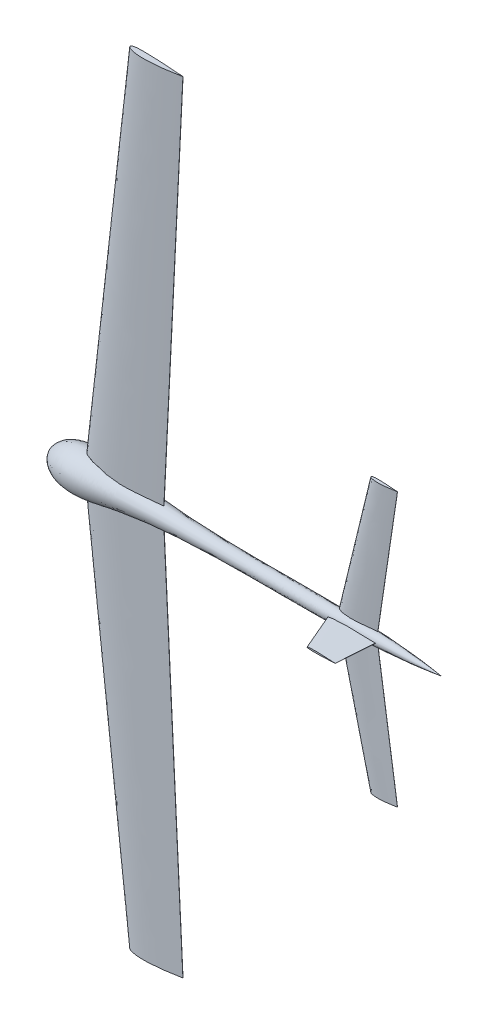
ISO-10303-21;
HEADER;
FILE_DESCRIPTION(('STEP AP214'),'2;1');
FILE_NAME('part.step','',(''),(''),'','','');
FILE_SCHEMA(('AUTOMOTIVE_DESIGN { 1 0 10303 214 1 1 1 1 }'));
ENDSEC;
DATA;
#1=APPLICATION_CONTEXT('core data for automotive mechanical design processes');
#2=APPLICATION_PROTOCOL_DEFINITION('international standard','automotive_design',2000,#1);
#3=PRODUCT_CONTEXT('',#1,'mechanical');
#4=PRODUCT('Part','Part','',(#3));
#5=PRODUCT_RELATED_PRODUCT_CATEGORY('part','',(#4));
#6=PRODUCT_DEFINITION_FORMATION('','',#4);
#7=PRODUCT_DEFINITION_CONTEXT('part definition',#1,'design');
#8=PRODUCT_DEFINITION('design','',#6,#7);
#9=PRODUCT_DEFINITION_SHAPE('','',#8);
#10=(LENGTH_UNIT() NAMED_UNIT(*) SI_UNIT(.MILLI.,.METRE.));
#11=(NAMED_UNIT(*) PLANE_ANGLE_UNIT() SI_UNIT($,.RADIAN.));
#12=(NAMED_UNIT(*) SI_UNIT($,.STERADIAN.) SOLID_ANGLE_UNIT());
#13=UNCERTAINTY_MEASURE_WITH_UNIT(LENGTH_MEASURE(1.E-05),#10,'distance_accuracy_value','');
#14=(GEOMETRIC_REPRESENTATION_CONTEXT(3) GLOBAL_UNCERTAINTY_ASSIGNED_CONTEXT((#13)) GLOBAL_UNIT_ASSIGNED_CONTEXT((#10,
#11,#12)) REPRESENTATION_CONTEXT('',''));
#15=CARTESIAN_POINT('',(0.,0.,0.));
#16=DIRECTION('',(0.,0.,1.));
#17=DIRECTION('',(1.,0.,0.));
#18=AXIS2_PLACEMENT_3D('',#15,#16,#17);
#19=CARTESIAN_POINT('',(-239.539873872403,-126.614051160963,871.963213135709));
#20=CARTESIAN_POINT('',(-189.539704872603,-1126.61405116096,872.054661040045));
#21=CARTESIAN_POINT('',(-252.815582554837,-126.614051160963,874.683587318627));
#22=CARTESIAN_POINT('',(-198.512245297456,-1126.61405116096,873.893257224312));
#23=CARTESIAN_POINT('',(-279.392779573486,-126.614051160963,879.477046379055));
#24=CARTESIAN_POINT('',(-216.474749622715,-1126.61405116096,877.13297166995));
#25=CARTESIAN_POINT('',(-312.798569751114,-126.614051160964,883.940220329952));
#26=CARTESIAN_POINT('',(-239.052437184474,-1126.61405116096,880.149459125009));
#27=CARTESIAN_POINT('',(-352.816565755391,-126.614051160964,887.437977106368));
#28=CARTESIAN_POINT('',(-266.099060115051,-1126.61405116096,882.513458277402));
#29=CARTESIAN_POINT('',(-388.154158791389,-126.614051160965,888.580982744142));
#30=CARTESIAN_POINT('',(-289.982378860363,-1126.61405116096,883.285971785803));
#31=CARTESIAN_POINT('',(-418.1706467062,-126.614051160965,883.718829971556));
#32=CARTESIAN_POINT('',(-310.269367500308,-1126.61405116096,879.999829904611));
#33=CARTESIAN_POINT('',(-429.627528598417,-126.614051160965,880.031523833943));
#34=CARTESIAN_POINT('',(-318.012632916842,-1126.61405116096,877.507721636047));
#35=CARTESIAN_POINT('',(-433.900062991578,-126.614051160965,878.140488463595));
#36=CARTESIAN_POINT('',(-320.900274433858,-1126.61405116096,876.229643628225));
#37=CARTESIAN_POINT('',(-437.585512532485,-126.614051160965,875.847817258417));
#38=CARTESIAN_POINT('',(-323.391127900182,-1126.61405116096,874.680115421375));
#39=CARTESIAN_POINT('',(-440.799349600757,-126.614051160965,871.882967439265));
#40=CARTESIAN_POINT('',(-325.563236651869,-1126.61405116096,872.000426063029));
#41=CARTESIAN_POINT('',(-437.461029176359,-126.614051160965,868.397936016131));
#42=CARTESIAN_POINT('',(-323.306994392,-1126.61405116096,869.645027487033));
#43=CARTESIAN_POINT('',(-433.844515168122,-126.614051160965,866.808443981054));
#44=CARTESIAN_POINT('',(-320.862731798404,-1126.61405116096,868.570751011037));
#45=CARTESIAN_POINT('',(-427.954506164582,-126.614051160965,865.136614206667));
#46=CARTESIAN_POINT('',(-316.881901459987,-1126.61405116096,867.440825626789));
#47=CARTESIAN_POINT('',(-409.647972663736,-126.614051160965,862.876897070003));
#48=CARTESIAN_POINT('',(-304.50922021152,-1126.61405116096,865.913569806219));
#49=CARTESIAN_POINT('',(-379.53459287153,-126.614051160964,863.285434449735));
#50=CARTESIAN_POINT('',(-284.156746081681,-1126.61405116096,866.189684493758));
#51=CARTESIAN_POINT('',(-346.191328323639,-126.614051160964,864.578538423401));
#52=CARTESIAN_POINT('',(-261.621317186019,-1126.61405116096,867.063643689067));
#53=CARTESIAN_POINT('',(-299.52844032516,-126.614051160963,867.374378483249));
#54=CARTESIAN_POINT('',(-230.083667564292,-1126.61405116096,868.953244354348));
#55=CARTESIAN_POINT('',(-266.197932885908,-126.614051160963,869.561951602312));
#56=CARTESIAN_POINT('',(-207.55686070725,-1126.61405116096,870.431740810743));
#57=CARTESIAN_POINT('',(-239.539873872403,-126.614051160963,871.443213575108));
#58=CARTESIAN_POINT('',(-189.539704872603,-1126.61405116096,871.703213355405));
#59=B_SPLINE_SURFACE_WITH_KNOTS('',3,1,((#19,#20),(#21,#22),(#23,#24),(#25,#26),(#27,#28),(#29,
#30),(#31,#32),(#33,#34),(#35,#36),(#37,#38),(#39,#40),(#41,#42),(#43,#44),(#45,#46),(#47,#48),
(#49,#50),(#51,#52),(#53,#54),(#55,#56),(#57,#58)),.UNSPECIFIED.,.F.,.F.,.F.,(4,1,1,1,1,1,1,1,1,
1,1,1,1,1,1,1,1,4),(2,2),(0.,0.0996729249269685,0.198581096615965,0.247805170456832,
0.395091203654929,0.457489818915221,0.470406405435489,0.483879408669829,0.491264120322896,
0.503458853294664,0.513609129403887,0.520450990700287,0.533235387615153,0.558031884237173,
0.656174271859652,0.754320378530032,0.803437363555032,1.),(0.,1.),.UNSPECIFIED.);
#60=CARTESIAN_POINT('',(-239.539873872403,-126.614051160963,871.963213135709));
#61=CARTESIAN_POINT('',(-252.815582554837,-126.614051160963,874.683587318627));
#62=CARTESIAN_POINT('',(-279.392779573486,-126.614051160963,879.477046379055));
#63=CARTESIAN_POINT('',(-312.798569751114,-126.614051160964,883.940220329952));
#64=CARTESIAN_POINT('',(-352.816565755391,-126.614051160964,887.437977106368));
#65=CARTESIAN_POINT('',(-388.154158791389,-126.614051160965,888.580982744142));
#66=CARTESIAN_POINT('',(-418.1706467062,-126.614051160965,883.718829971556));
#67=CARTESIAN_POINT('',(-429.627528598417,-126.614051160965,880.031523833943));
#68=CARTESIAN_POINT('',(-433.900062991578,-126.614051160965,878.140488463595));
#69=CARTESIAN_POINT('',(-437.585512532485,-126.614051160965,875.847817258417));
#70=CARTESIAN_POINT('',(-440.799349600757,-126.614051160965,871.882967439265));
#71=CARTESIAN_POINT('',(-437.461029176359,-126.614051160965,868.397936016131));
#72=CARTESIAN_POINT('',(-433.844515168122,-126.614051160965,866.808443981054));
#73=CARTESIAN_POINT('',(-427.954506164582,-126.614051160965,865.136614206667));
#74=CARTESIAN_POINT('',(-409.647972663736,-126.614051160965,862.876897070003));
#75=CARTESIAN_POINT('',(-379.53459287153,-126.614051160964,863.285434449735));
#76=CARTESIAN_POINT('',(-346.191328323639,-126.614051160964,864.578538423401));
#77=CARTESIAN_POINT('',(-299.52844032516,-126.614051160963,867.374378483249));
#78=CARTESIAN_POINT('',(-266.197932885908,-126.614051160963,869.561951602312));
#79=CARTESIAN_POINT('',(-239.539873872403,-126.614051160963,871.443213575108));
#80=B_SPLINE_CURVE_WITH_KNOTS('',3,(#60,#61,#62,#63,#64,#65,#66,#67,#68,#69,#70,#71,#72,#73,#74,
#75,#76,#77,#78,#79),.UNSPECIFIED.,.F.,.F.,(4,1,1,1,1,1,1,1,1,1,1,1,1,1,1,1,1,4),(0.,
0.0996729249269685,0.198581096615965,0.247805170456832,0.395091203654929,0.457489818915221,
0.470406405435489,0.483879408669829,0.491264120322896,0.503458853294664,0.513609129403887,
0.520450990700287,0.533235387615153,0.558031884237173,0.656174271859652,0.754320378530032,
0.803437363555032,1.),.UNSPECIFIED.);
#81=CARTESIAN_POINT('',(-239.539873872403,-126.614051160963,871.963213135709));
#82=VERTEX_POINT('',#81);
#83=CARTESIAN_POINT('',(-239.539873872403,-126.614051160963,871.443213575108));
#84=VERTEX_POINT('',#83);
#85=EDGE_CURVE('P0_E10',#82,#84,#80,.T.);
#86=DIRECTION('',(0.0499377836282304,-0.998752296785844,0.000259675377735938));
#87=VECTOR('',#86,1.);
#88=CARTESIAN_POINT('',(-214.539789372503,-626.614051160962,871.573213465257));
#89=LINE('',#88,#87);
#90=CARTESIAN_POINT('',(-189.539704872603,-1126.61405116096,871.703213355405));
#91=VERTEX_POINT('',#90);
#92=EDGE_CURVE('P0_E26',#84,#91,#89,.T.);
#93=CARTESIAN_POINT('',(-189.539704872603,-1126.61405116096,872.054661040045));
#94=CARTESIAN_POINT('',(-198.512245297456,-1126.61405116096,873.893257224312));
#95=CARTESIAN_POINT('',(-216.474749622715,-1126.61405116096,877.13297166995));
#96=CARTESIAN_POINT('',(-239.052437184474,-1126.61405116096,880.149459125009));
#97=CARTESIAN_POINT('',(-266.099060115051,-1126.61405116096,882.513458277402));
#98=CARTESIAN_POINT('',(-289.982378860363,-1126.61405116096,883.285971785803));
#99=CARTESIAN_POINT('',(-310.269367500308,-1126.61405116096,879.999829904611));
#100=CARTESIAN_POINT('',(-318.012632916842,-1126.61405116096,877.507721636047));
#101=CARTESIAN_POINT('',(-320.900274433858,-1126.61405116096,876.229643628225));
#102=CARTESIAN_POINT('',(-323.391127900182,-1126.61405116096,874.680115421375));
#103=CARTESIAN_POINT('',(-325.563236651869,-1126.61405116096,872.000426063029));
#104=CARTESIAN_POINT('',(-323.306994392,-1126.61405116096,869.645027487033));
#105=CARTESIAN_POINT('',(-320.862731798404,-1126.61405116096,868.570751011037));
#106=CARTESIAN_POINT('',(-316.881901459987,-1126.61405116096,867.440825626789));
#107=CARTESIAN_POINT('',(-304.50922021152,-1126.61405116096,865.913569806219));
#108=CARTESIAN_POINT('',(-284.156746081681,-1126.61405116096,866.189684493758));
#109=CARTESIAN_POINT('',(-261.621317186019,-1126.61405116096,867.063643689067));
#110=CARTESIAN_POINT('',(-230.083667564292,-1126.61405116096,868.953244354348));
#111=CARTESIAN_POINT('',(-207.55686070725,-1126.61405116096,870.431740810743));
#112=CARTESIAN_POINT('',(-189.539704872603,-1126.61405116096,871.703213355405));
#113=B_SPLINE_CURVE_WITH_KNOTS('',3,(#93,#94,#95,#96,#97,#98,#99,#100,#101,#102,#103,#104,#105,
#106,#107,#108,#109,#110,#111,#112),.UNSPECIFIED.,.F.,.F.,(4,1,1,1,1,1,1,1,1,1,1,1,1,1,1,1,1,4),
(0.,0.0996729249269685,0.198581096615965,0.247805170456832,0.395091203654929,0.457489818915221,
0.470406405435489,0.483879408669829,0.491264120322896,0.503458853294664,0.513609129403887,
0.520450990700287,0.533235387615153,0.558031884237173,0.656174271859652,0.754320378530032,
0.803437363555032,1.),.UNSPECIFIED.);
#114=CARTESIAN_POINT('',(-189.539704872603,-1126.61405116096,872.054661040045));
#115=VERTEX_POINT('',#114);
#116=EDGE_CURVE('P0_E71',#115,#91,#113,.T.);
#117=DIRECTION('',(0.0499377851036283,-0.998752326293701,9.13338071910447E-05));
#118=VECTOR('',#117,1.);
#119=CARTESIAN_POINT('',(-214.539789372503,-626.614051160962,872.008937087877));
#120=LINE('',#119,#118);
#121=EDGE_CURVE('P0_E69',#82,#115,#120,.T.);
#122=ORIENTED_EDGE('',*,*,#85,.T.);
#123=ORIENTED_EDGE('',*,*,#92,.T.);
#124=ORIENTED_EDGE('',*,*,#116,.F.);
#125=ORIENTED_EDGE('',*,*,#121,.F.);
#126=EDGE_LOOP('',(#122,#123,#124,#125));
#127=FACE_BOUND('',#126,.T.);
#128=ADVANCED_FACE('P0_F16',(#127),#59,.T.);
#129=CARTESIAN_POINT('',(-239.539873872403,-126.614051160963,871.443213575108));
#130=DIRECTION('',(0.998752330459429,0.0499377853119154,0.));
#131=DIRECTION('',(0.,0.,1.));
#132=AXIS2_PLACEMENT_3D('',#129,#130,#131);
#133=PLANE('',#132);
#134=DIRECTION('',(0.,0.,1.));
#135=VECTOR('',#134,1.);
#136=CARTESIAN_POINT('',(-239.539873872403,-126.614051160963,871.703213355408));
#137=LINE('',#136,#135);
#138=EDGE_CURVE('P0_E59',#84,#82,#137,.T.);
#139=ORIENTED_EDGE('',*,*,#138,.T.);
#140=ORIENTED_EDGE('',*,*,#121,.T.);
#141=DIRECTION('',(0.,0.,1.));
#142=VECTOR('',#141,1.);
#143=CARTESIAN_POINT('',(-189.539704872603,-1126.61405116096,871.878937197725));
#144=LINE('',#143,#142);
#145=EDGE_CURVE('P0_E20',#91,#115,#144,.T.);
#146=ORIENTED_EDGE('',*,*,#145,.F.);
#147=ORIENTED_EDGE('',*,*,#92,.F.);
#148=EDGE_LOOP('',(#139,#140,#146,#147));
#149=FACE_BOUND('',#148,.T.);
#150=ADVANCED_FACE('P0_F18',(#149),#133,.T.);
#151=CARTESIAN_POINT('',(-324.586192315454,-1126.61405116096,872.767026516571));
#152=DIRECTION('',(0.,1.,0.));
#153=DIRECTION('',(-1.,0.,0.));
#154=AXIS2_PLACEMENT_3D('',#151,#152,#153);
#155=PLANE('',#154);
#156=ORIENTED_EDGE('',*,*,#116,.T.);
#157=ORIENTED_EDGE('',*,*,#145,.T.);
#158=EDGE_LOOP('',(#156,#157));
#159=FACE_BOUND('',#158,.T.);
#160=ADVANCED_FACE('P0_F106',(#159),#155,.F.);
#161=CARTESIAN_POINT('',(-239.539873872403,-126.614051160963,871.963213135709));
#162=CARTESIAN_POINT('',(-189.539704872631,873.385948839038,872.054661040052));
#163=CARTESIAN_POINT('',(-252.815582554837,-126.614051160963,874.683587318627));
#164=CARTESIAN_POINT('',(-198.512245297484,873.385948839038,873.893257224319));
#165=CARTESIAN_POINT('',(-279.392779573486,-126.614051160963,879.477046379055));
#166=CARTESIAN_POINT('',(-216.474749622743,873.385948839037,877.132971669957));
#167=CARTESIAN_POINT('',(-312.798569751114,-126.614051160964,883.940220329952));
#168=CARTESIAN_POINT('',(-239.052437184502,873.385948839037,880.149459125016));
#169=CARTESIAN_POINT('',(-352.816565755391,-126.614051160964,887.437977106368));
#170=CARTESIAN_POINT('',(-266.099060115078,873.385948839037,882.513458277409));
#171=CARTESIAN_POINT('',(-388.154158791389,-126.614051160965,888.580982744142));
#172=CARTESIAN_POINT('',(-289.982378860391,873.385948839036,883.28597178581));
#173=CARTESIAN_POINT('',(-418.1706467062,-126.614051160965,883.718829971556));
#174=CARTESIAN_POINT('',(-310.269367500336,873.385948839037,879.999829904618));
#175=CARTESIAN_POINT('',(-429.627528598417,-126.614051160965,880.031523833943));
#176=CARTESIAN_POINT('',(-318.01263291687,873.385948839036,877.507721636054));
#177=CARTESIAN_POINT('',(-433.900062991578,-126.614051160965,878.140488463595));
#178=CARTESIAN_POINT('',(-320.900274433886,873.385948839036,876.229643628232));
#179=CARTESIAN_POINT('',(-437.585512532485,-126.614051160965,875.847817258417));
#180=CARTESIAN_POINT('',(-323.39112790021,873.385948839036,874.680115421382));
#181=CARTESIAN_POINT('',(-440.799349600757,-126.614051160965,871.882967439265));
#182=CARTESIAN_POINT('',(-325.563236651897,873.385948839036,872.000426063036));
#183=CARTESIAN_POINT('',(-437.461029176359,-126.614051160965,868.397936016131));
#184=CARTESIAN_POINT('',(-323.306994392028,873.385948839036,869.64502748704));
#185=CARTESIAN_POINT('',(-433.844515168122,-126.614051160965,866.808443981054));
#186=CARTESIAN_POINT('',(-320.862731798432,873.385948839036,868.570751011044));
#187=CARTESIAN_POINT('',(-427.954506164582,-126.614051160965,865.136614206667));
#188=CARTESIAN_POINT('',(-316.881901460015,873.385948839036,867.440825626796));
#189=CARTESIAN_POINT('',(-409.647972663736,-126.614051160965,862.876897070003));
#190=CARTESIAN_POINT('',(-304.509220211548,873.385948839036,865.913569806226));
#191=CARTESIAN_POINT('',(-379.53459287153,-126.614051160964,863.285434449735));
#192=CARTESIAN_POINT('',(-284.156746081709,873.385948839037,866.189684493765));
#193=CARTESIAN_POINT('',(-346.191328323639,-126.614051160964,864.578538423401));
#194=CARTESIAN_POINT('',(-261.621317186047,873.385948839037,867.063643689074));
#195=CARTESIAN_POINT('',(-299.52844032516,-126.614051160963,867.374378483249));
#196=CARTESIAN_POINT('',(-230.08366756432,873.385948839038,868.953244354355));
#197=CARTESIAN_POINT('',(-266.197932885908,-126.614051160963,869.561951602312));
#198=CARTESIAN_POINT('',(-207.556860707278,873.385948839038,870.43174081075));
#199=CARTESIAN_POINT('',(-239.539873872403,-126.614051160963,871.443213575108));
#200=CARTESIAN_POINT('',(-189.539704872631,873.385948839038,871.703213355412));
#201=B_SPLINE_SURFACE_WITH_KNOTS('',3,1,((#161,#162),(#163,#164),(#165,#166),(#167,#168),(#169,
#170),(#171,#172),(#173,#174),(#175,#176),(#177,#178),(#179,#180),(#181,#182),(#183,#184),(#185,
#186),(#187,#188),(#189,#190),(#191,#192),(#193,#194),(#195,#196),(#197,#198),(#199,#200)),
.UNSPECIFIED.,.F.,.F.,.F.,(4,1,1,1,1,1,1,1,1,1,1,1,1,1,1,1,1,4),(2,2),(0.,0.0996729249269685,
0.198581096615965,0.247805170456832,0.395091203654929,0.457489818915221,0.470406405435489,
0.483879408669829,0.491264120322896,0.503458853294664,0.513609129403887,0.520450990700287,
0.533235387615153,0.558031884237173,0.656174271859652,0.754320378530032,0.803437363555032,1.),
(0.,1.),.UNSPECIFIED.);
#202=DIRECTION('',(0.0499377851036004,0.998752326293702,9.13338071980189E-05));
#203=VECTOR('',#202,1.);
#204=CARTESIAN_POINT('',(-214.539789372517,373.385948839038,872.00893708788));
#205=LINE('',#204,#203);
#206=CARTESIAN_POINT('',(-189.539704872631,873.385948839038,872.054661040052));
#207=VERTEX_POINT('',#206);
#208=EDGE_CURVE('P0_E56',#82,#207,#205,.T.);
#209=CARTESIAN_POINT('',(-189.539704872631,873.385948839038,872.054661040052));
#210=CARTESIAN_POINT('',(-198.512245297484,873.385948839038,873.893257224319));
#211=CARTESIAN_POINT('',(-216.474749622743,873.385948839037,877.132971669957));
#212=CARTESIAN_POINT('',(-239.052437184502,873.385948839037,880.149459125016));
#213=CARTESIAN_POINT('',(-266.099060115078,873.385948839037,882.513458277409));
#214=CARTESIAN_POINT('',(-289.982378860391,873.385948839036,883.28597178581));
#215=CARTESIAN_POINT('',(-310.269367500336,873.385948839037,879.999829904618));
#216=CARTESIAN_POINT('',(-318.01263291687,873.385948839036,877.507721636054));
#217=CARTESIAN_POINT('',(-320.900274433886,873.385948839036,876.229643628232));
#218=CARTESIAN_POINT('',(-323.39112790021,873.385948839036,874.680115421382));
#219=CARTESIAN_POINT('',(-325.563236651897,873.385948839036,872.000426063036));
#220=CARTESIAN_POINT('',(-323.306994392028,873.385948839036,869.64502748704));
#221=CARTESIAN_POINT('',(-320.862731798432,873.385948839036,868.570751011044));
#222=CARTESIAN_POINT('',(-316.881901460015,873.385948839036,867.440825626796));
#223=CARTESIAN_POINT('',(-304.509220211548,873.385948839036,865.913569806226));
#224=CARTESIAN_POINT('',(-284.156746081709,873.385948839037,866.189684493765));
#225=CARTESIAN_POINT('',(-261.621317186047,873.385948839037,867.063643689074));
#226=CARTESIAN_POINT('',(-230.08366756432,873.385948839038,868.953244354355));
#227=CARTESIAN_POINT('',(-207.556860707278,873.385948839038,870.43174081075));
#228=CARTESIAN_POINT('',(-189.539704872631,873.385948839038,871.703213355412));
#229=B_SPLINE_CURVE_WITH_KNOTS('',3,(#209,#210,#211,#212,#213,#214,#215,#216,#217,#218,#219,
#220,#221,#222,#223,#224,#225,#226,#227,#228),.UNSPECIFIED.,.F.,.F.,(4,1,1,1,1,1,1,1,1,1,1,1,1,
1,1,1,1,4),(0.,0.0996729249269685,0.198581096615965,0.247805170456832,0.395091203654929,
0.457489818915221,0.470406405435489,0.483879408669829,0.491264120322896,0.503458853294664,
0.513609129403887,0.520450990700287,0.533235387615153,0.558031884237173,0.656174271859652,
0.754320378530032,0.803437363555032,1.),.UNSPECIFIED.);
#230=CARTESIAN_POINT('',(-189.539704872631,873.385948839038,871.703213355412));
#231=VERTEX_POINT('',#230);
#232=EDGE_CURVE('P0_E60',#207,#231,#229,.T.);
#233=DIRECTION('',(0.0499377836282025,0.998752296785845,0.000259675377742912));
#234=VECTOR('',#233,1.);
#235=CARTESIAN_POINT('',(-214.539789372517,373.385948839038,871.57321346526));
#236=LINE('',#235,#234);
#237=EDGE_CURVE('P0_E34',#84,#231,#236,.T.);
#238=ORIENTED_EDGE('',*,*,#85,.F.);
#239=ORIENTED_EDGE('',*,*,#208,.T.);
#240=ORIENTED_EDGE('',*,*,#232,.T.);
#241=ORIENTED_EDGE('',*,*,#237,.F.);
#242=EDGE_LOOP('',(#238,#239,#240,#241));
#243=FACE_BOUND('',#242,.T.);
#244=ADVANCED_FACE('P0_F62',(#243),#201,.F.);
#245=CARTESIAN_POINT('',(-239.539873872403,-126.614051160963,871.443213575108));
#246=DIRECTION('',(0.998752330459431,-0.0499377853118875,0.));
#247=DIRECTION('',(0.,0.,1.));
#248=AXIS2_PLACEMENT_3D('',#245,#246,#247);
#249=PLANE('',#248);
#250=ORIENTED_EDGE('',*,*,#138,.F.);
#251=ORIENTED_EDGE('',*,*,#237,.T.);
#252=DIRECTION('',(0.,0.,1.));
#253=VECTOR('',#252,1.);
#254=CARTESIAN_POINT('',(-189.539704872631,873.385948839038,871.878937197732));
#255=LINE('',#254,#253);
#256=EDGE_CURVE('P0_E50',#231,#207,#255,.T.);
#257=ORIENTED_EDGE('',*,*,#256,.T.);
#258=ORIENTED_EDGE('',*,*,#208,.F.);
#259=EDGE_LOOP('',(#250,#251,#257,#258));
#260=FACE_BOUND('',#259,.T.);
#261=ADVANCED_FACE('P0_F57',(#260),#249,.T.);
#262=CARTESIAN_POINT('',(-324.586192315482,873.385948839036,872.767026516578));
#263=DIRECTION('',(0.,-1.,0.));
#264=DIRECTION('',(-1.,0.,0.));
#265=AXIS2_PLACEMENT_3D('',#262,#263,#264);
#266=PLANE('',#265);
#267=ORIENTED_EDGE('',*,*,#232,.F.);
#268=ORIENTED_EDGE('',*,*,#256,.F.);
#269=EDGE_LOOP('',(#267,#268));
#270=FACE_BOUND('',#269,.T.);
#271=ADVANCED_FACE('P0_F92',(#270),#266,.F.);
#272=CLOSED_SHELL('',(#128,#150,#160,#244,#261,#271));
#273=MANIFOLD_SOLID_BREP('P0_B1',#272);
#274=CARTESIAN_POINT('',(301.273415612789,-129.208156073062,865.703216559468));
#275=CARTESIAN_POINT('',(353.845526521441,-479.208156073061,865.748940511637));
#276=CARTESIAN_POINT('',(294.635561271572,-129.208156073062,867.063403650928));
#277=CARTESIAN_POINT('',(349.359256309014,-479.208156073061,866.668238603771));
#278=CARTESIAN_POINT('',(281.346962762247,-129.208156073062,869.460133181141));
#279=CARTESIAN_POINT('',(340.378004146384,-479.208156073062,868.28809582659));
#280=CARTESIAN_POINT('',(264.644067673434,-129.208156073063,871.69172015659));
#281=CARTESIAN_POINT('',(329.089160365505,-479.208156073062,869.796339554119));
#282=CARTESIAN_POINT('',(244.635069671295,-129.208156073063,873.440598544798));
#283=CARTESIAN_POINT('',(315.565848900217,-479.208156073062,870.978339130316));
#284=CARTESIAN_POINT('',(226.966273153296,-129.208156073063,874.012101363685));
#285=CARTESIAN_POINT('',(303.624189527561,-479.208156073062,871.364595884516));
#286=CARTESIAN_POINT('',(211.95802919589,-129.208156073063,871.581024977392));
#287=CARTESIAN_POINT('',(293.480695207588,-479.208156073062,869.72152494392));
#288=CARTESIAN_POINT('',(206.229588249782,-129.208156073063,869.737371908585));
#289=CARTESIAN_POINT('',(289.609062499321,-479.208156073062,868.475470809638));
#290=CARTESIAN_POINT('',(204.093321053202,-129.208156073064,868.791854223412));
#291=CARTESIAN_POINT('',(288.165241740813,-479.208156073062,867.836431805727));
#292=CARTESIAN_POINT('',(202.250596282748,-129.208156073064,867.645518620822));
#293=CARTESIAN_POINT('',(286.919815007651,-479.208156073062,867.061667702302));
#294=CARTESIAN_POINT('',(200.643677748612,-129.208156073064,865.663093711246));
#295=CARTESIAN_POINT('',(285.833760631808,-479.208156073062,865.721823023129));
#296=CARTESIAN_POINT('',(202.312837960811,-129.208156073064,863.920577999679));
#297=CARTESIAN_POINT('',(286.961881761742,-479.208156073062,864.544123735131));
#298=CARTESIAN_POINT('',(204.121094964929,-129.208156073063,863.125831982141));
#299=CARTESIAN_POINT('',(288.18401305854,-479.208156073062,864.006985497133));
#300=CARTESIAN_POINT('',(207.0660994667,-129.208156073063,862.289917094947));
#301=CARTESIAN_POINT('',(290.174428227749,-479.208156073062,863.44202280501));
#302=CARTESIAN_POINT('',(216.219366217122,-129.208156073063,861.160058526616));
#303=CARTESIAN_POINT('',(296.360768851982,-479.208156073062,862.678394894724));
#304=CARTESIAN_POINT('',(231.276056113225,-129.208156073063,861.364327216482));
#305=CARTESIAN_POINT('',(306.537005916901,-479.208156073062,862.816452238494));
#306=CARTESIAN_POINT('',(247.947688387171,-129.208156073063,862.010879203314));
#307=CARTESIAN_POINT('',(317.804720364732,-479.208156073062,863.253431836148));
#308=CARTESIAN_POINT('',(271.279132386411,-129.208156073063,863.408799233238));
#309=CARTESIAN_POINT('',(333.573545175596,-479.208156073062,864.198232168789));
#310=CARTESIAN_POINT('',(287.944386106036,-129.208156073062,864.50258579277));
#311=CARTESIAN_POINT('',(344.836948604117,-479.208156073062,864.937480396986));
#312=CARTESIAN_POINT('',(301.273415612789,-129.208156073062,865.443216779168));
#313=CARTESIAN_POINT('',(353.845526521441,-479.208156073061,865.573216669318));
#314=B_SPLINE_SURFACE_WITH_KNOTS('',3,1,((#274,#275),(#276,#277),(#278,#279),(#280,#281),(#282,
#283),(#284,#285),(#286,#287),(#288,#289),(#290,#291),(#292,#293),(#294,#295),(#296,#297),(#298,
#299),(#300,#301),(#302,#303),(#304,#305),(#306,#307),(#308,#309),(#310,#311),(#312,#313)),
.UNSPECIFIED.,.F.,.F.,.F.,(4,1,1,1,1,1,1,1,1,1,1,1,1,1,1,1,1,4),(2,2),(0.,0.0996729249269685,
0.198581096615965,0.247805170456832,0.395091203654929,0.457489818915221,0.470406405435489,
0.483879408669829,0.491264120322896,0.503458853294664,0.513609129403887,0.520450990700287,
0.533235387615153,0.558031884237173,0.656174271859652,0.754320378530032,0.803437363555032,1.),
(0.,1.),.UNSPECIFIED.);
#315=CARTESIAN_POINT('',(301.273415612789,-129.208156073062,865.703216559468));
#316=CARTESIAN_POINT('',(294.635561271572,-129.208156073062,867.063403650928));
#317=CARTESIAN_POINT('',(281.346962762247,-129.208156073062,869.460133181141));
#318=CARTESIAN_POINT('',(264.644067673434,-129.208156073063,871.69172015659));
#319=CARTESIAN_POINT('',(244.635069671295,-129.208156073063,873.440598544798));
#320=CARTESIAN_POINT('',(226.966273153296,-129.208156073063,874.012101363685));
#321=CARTESIAN_POINT('',(211.95802919589,-129.208156073063,871.581024977392));
#322=CARTESIAN_POINT('',(206.229588249782,-129.208156073063,869.737371908585));
#323=CARTESIAN_POINT('',(204.093321053202,-129.208156073064,868.791854223412));
#324=CARTESIAN_POINT('',(202.250596282748,-129.208156073064,867.645518620822));
#325=CARTESIAN_POINT('',(200.643677748612,-129.208156073064,865.663093711246));
#326=CARTESIAN_POINT('',(202.312837960811,-129.208156073064,863.920577999679));
#327=CARTESIAN_POINT('',(204.121094964929,-129.208156073063,863.125831982141));
#328=CARTESIAN_POINT('',(207.0660994667,-129.208156073063,862.289917094947));
#329=CARTESIAN_POINT('',(216.219366217122,-129.208156073063,861.160058526616));
#330=CARTESIAN_POINT('',(231.276056113225,-129.208156073063,861.364327216482));
#331=CARTESIAN_POINT('',(247.947688387171,-129.208156073063,862.010879203314));
#332=CARTESIAN_POINT('',(271.279132386411,-129.208156073063,863.408799233238));
#333=CARTESIAN_POINT('',(287.944386106036,-129.208156073062,864.50258579277));
#334=CARTESIAN_POINT('',(301.273415612789,-129.208156073062,865.443216779168));
#335=B_SPLINE_CURVE_WITH_KNOTS('',3,(#315,#316,#317,#318,#319,#320,#321,#322,#323,#324,#325,
#326,#327,#328,#329,#330,#331,#332,#333,#334),.UNSPECIFIED.,.F.,.F.,(4,1,1,1,1,1,1,1,1,1,1,1,1,
1,1,1,1,4),(0.,0.0996729249269685,0.198581096615965,0.247805170456832,0.395091203654929,
0.457489818915221,0.470406405435489,0.483879408669829,0.491264120322896,0.503458853294664,
0.513609129403887,0.520450990700287,0.533235387615153,0.558031884237173,0.656174271859652,
0.754320378530032,0.803437363555032,1.),.UNSPECIFIED.);
#336=CARTESIAN_POINT('',(301.273415612789,-129.208156073062,865.703216559468));
#337=VERTEX_POINT('',#336);
#338=CARTESIAN_POINT('',(301.273415612789,-129.208156073062,865.443216779168));
#339=VERTEX_POINT('',#338);
#340=EDGE_CURVE('P1_E11',#337,#339,#335,.T.);
#341=DIRECTION('',(0.148539702049686,-0.988906376761719,0.000367307772420894));
#342=VECTOR('',#341,1.);
#343=CARTESIAN_POINT('',(327.559471067115,-304.208156073062,865.508216724243));
#344=LINE('',#343,#342);
#345=CARTESIAN_POINT('',(353.845526521441,-479.208156073061,865.573216669318));
#346=VERTEX_POINT('',#345);
#347=EDGE_CURVE('P1_E27',#339,#346,#344,.T.);
#348=CARTESIAN_POINT('',(353.845526521441,-479.208156073061,865.748940511637));
#349=CARTESIAN_POINT('',(349.359256309014,-479.208156073061,866.668238603771));
#350=CARTESIAN_POINT('',(340.378004146384,-479.208156073062,868.28809582659));
#351=CARTESIAN_POINT('',(329.089160365505,-479.208156073062,869.796339554119));
#352=CARTESIAN_POINT('',(315.565848900217,-479.208156073062,870.978339130316));
#353=CARTESIAN_POINT('',(303.624189527561,-479.208156073062,871.364595884516));
#354=CARTESIAN_POINT('',(293.480695207588,-479.208156073062,869.72152494392));
#355=CARTESIAN_POINT('',(289.609062499321,-479.208156073062,868.475470809638));
#356=CARTESIAN_POINT('',(288.165241740813,-479.208156073062,867.836431805727));
#357=CARTESIAN_POINT('',(286.919815007651,-479.208156073062,867.061667702302));
#358=CARTESIAN_POINT('',(285.833760631808,-479.208156073062,865.721823023129));
#359=CARTESIAN_POINT('',(286.961881761742,-479.208156073062,864.544123735131));
#360=CARTESIAN_POINT('',(288.18401305854,-479.208156073062,864.006985497133));
#361=CARTESIAN_POINT('',(290.174428227749,-479.208156073062,863.44202280501));
#362=CARTESIAN_POINT('',(296.360768851982,-479.208156073062,862.678394894724));
#363=CARTESIAN_POINT('',(306.537005916901,-479.208156073062,862.816452238494));
#364=CARTESIAN_POINT('',(317.804720364732,-479.208156073062,863.253431836148));
#365=CARTESIAN_POINT('',(333.573545175596,-479.208156073062,864.198232168789));
#366=CARTESIAN_POINT('',(344.836948604117,-479.208156073062,864.937480396986));
#367=CARTESIAN_POINT('',(353.845526521441,-479.208156073061,865.573216669318));
#368=B_SPLINE_CURVE_WITH_KNOTS('',3,(#348,#349,#350,#351,#352,#353,#354,#355,#356,#357,#358,
#359,#360,#361,#362,#363,#364,#365,#366,#367),.UNSPECIFIED.,.F.,.F.,(4,1,1,1,1,1,1,1,1,1,1,1,1,
1,1,1,1,4),(0.,0.0996729249269685,0.198581096615965,0.247805170456832,0.395091203654929,
0.457489818915221,0.470406405435489,0.483879408669829,0.491264120322896,0.503458853294664,
0.513609129403887,0.520450990700287,0.533235387615153,0.558031884237173,0.656174271859652,
0.754320378530032,0.803437363555032,1.),.UNSPECIFIED.);
#369=CARTESIAN_POINT('',(353.845526521441,-479.208156073061,865.748940511637));
#370=VERTEX_POINT('',#369);
#371=EDGE_CURVE('P1_E72',#370,#346,#368,.T.);
#372=DIRECTION('',(0.148539710830224,-0.988906435218348,0.000129190601553803));
#373=VECTOR('',#372,1.);
#374=CARTESIAN_POINT('',(327.559471067115,-304.208156073062,865.726078535553));
#375=LINE('',#374,#373);
#376=EDGE_CURVE('P1_E70',#337,#370,#375,.T.);
#377=ORIENTED_EDGE('',*,*,#340,.T.);
#378=ORIENTED_EDGE('',*,*,#347,.T.);
#379=ORIENTED_EDGE('',*,*,#371,.F.);
#380=ORIENTED_EDGE('',*,*,#376,.F.);
#381=EDGE_LOOP('',(#377,#378,#379,#380));
#382=FACE_BOUND('',#381,.T.);
#383=ADVANCED_FACE('P1_F17',(#382),#314,.T.);
#384=CARTESIAN_POINT('',(301.273415612789,-129.208156073062,865.443216779168));
#385=DIRECTION('',(0.988906443470877,0.148539712069804,0.));
#386=DIRECTION('',(0.,0.,1.));
#387=AXIS2_PLACEMENT_3D('',#384,#385,#386);
#388=PLANE('',#387);
#389=DIRECTION('',(0.,0.,1.));
#390=VECTOR('',#389,1.);
#391=CARTESIAN_POINT('',(301.273415612789,-129.208156073062,865.573216669318));
#392=LINE('',#391,#390);
#393=EDGE_CURVE('P1_E60',#339,#337,#392,.T.);
#394=ORIENTED_EDGE('',*,*,#393,.T.);
#395=ORIENTED_EDGE('',*,*,#376,.T.);
#396=DIRECTION('',(0.,0.,1.));
#397=VECTOR('',#396,1.);
#398=CARTESIAN_POINT('',(353.845526521441,-479.208156073061,865.661078590477));
#399=LINE('',#398,#397);
#400=EDGE_CURVE('P1_E21',#346,#370,#399,.T.);
#401=ORIENTED_EDGE('',*,*,#400,.F.);
#402=ORIENTED_EDGE('',*,*,#347,.F.);
#403=EDGE_LOOP('',(#394,#395,#401,#402));
#404=FACE_BOUND('',#403,.T.);
#405=ADVANCED_FACE('P1_F19',(#404),#388,.T.);
#406=CARTESIAN_POINT('',(286.322282800015,-479.208156073062,866.1051232499));
#407=DIRECTION('',(0.,1.,0.));
#408=DIRECTION('',(-1.,0.,0.));
#409=AXIS2_PLACEMENT_3D('',#406,#407,#408);
#410=PLANE('',#409);
#411=ORIENTED_EDGE('',*,*,#371,.T.);
#412=ORIENTED_EDGE('',*,*,#400,.T.);
#413=EDGE_LOOP('',(#411,#412));
#414=FACE_BOUND('',#413,.T.);
#415=ADVANCED_FACE('P1_F107',(#414),#410,.F.);
#416=CARTESIAN_POINT('',(301.273415612789,-129.208156073062,865.703216559468));
#417=CARTESIAN_POINT('',(353.845526521431,220.791843926939,865.74894051164));
#418=CARTESIAN_POINT('',(294.635561271572,-129.208156073062,867.063403650928));
#419=CARTESIAN_POINT('',(349.359256309004,220.791843926938,866.668238603773));
#420=CARTESIAN_POINT('',(281.346962762247,-129.208156073062,869.460133181141));
#421=CARTESIAN_POINT('',(340.378004146375,220.791843926938,868.288095826593));
#422=CARTESIAN_POINT('',(264.644067673434,-129.208156073063,871.69172015659));
#423=CARTESIAN_POINT('',(329.089160365496,220.791843926938,869.796339554122));
#424=CARTESIAN_POINT('',(244.635069671295,-129.208156073063,873.440598544798));
#425=CARTESIAN_POINT('',(315.565848900207,220.791843926938,870.978339130318));
#426=CARTESIAN_POINT('',(226.966273153296,-129.208156073063,874.012101363685));
#427=CARTESIAN_POINT('',(303.624189527551,220.791843926938,871.364595884519));
#428=CARTESIAN_POINT('',(211.95802919589,-129.208156073063,871.581024977392));
#429=CARTESIAN_POINT('',(293.480695207579,220.791843926938,869.721524943923));
#430=CARTESIAN_POINT('',(206.229588249782,-129.208156073063,869.737371908585));
#431=CARTESIAN_POINT('',(289.609062499311,220.791843926938,868.475470809641));
#432=CARTESIAN_POINT('',(204.093321053202,-129.208156073064,868.791854223412));
#433=CARTESIAN_POINT('',(288.165241740803,220.791843926938,867.83643180573));
#434=CARTESIAN_POINT('',(202.250596282748,-129.208156073064,867.645518620822));
#435=CARTESIAN_POINT('',(286.919815007641,220.791843926938,867.061667702305));
#436=CARTESIAN_POINT('',(200.643677748612,-129.208156073064,865.663093711246));
#437=CARTESIAN_POINT('',(285.833760631798,220.791843926938,865.721823023132));
#438=CARTESIAN_POINT('',(202.312837960811,-129.208156073064,863.920577999679));
#439=CARTESIAN_POINT('',(286.961881761733,220.791843926938,864.544123735134));
#440=CARTESIAN_POINT('',(204.121094964929,-129.208156073063,863.125831982141));
#441=CARTESIAN_POINT('',(288.184013058531,220.791843926938,864.006985497136));
#442=CARTESIAN_POINT('',(207.0660994667,-129.208156073063,862.289917094947));
#443=CARTESIAN_POINT('',(290.174428227739,220.791843926938,863.442022805012));
#444=CARTESIAN_POINT('',(216.219366217122,-129.208156073063,861.160058526616));
#445=CARTESIAN_POINT('',(296.360768851972,220.791843926938,862.678394894727));
#446=CARTESIAN_POINT('',(231.276056113225,-129.208156073063,861.364327216482));
#447=CARTESIAN_POINT('',(306.537005916892,220.791843926938,862.816452238496));
#448=CARTESIAN_POINT('',(247.947688387171,-129.208156073063,862.010879203314));
#449=CARTESIAN_POINT('',(317.804720364723,220.791843926938,863.25343183615));
#450=CARTESIAN_POINT('',(271.279132386411,-129.208156073063,863.408799233238));
#451=CARTESIAN_POINT('',(333.573545175587,220.791843926938,864.198232168791));
#452=CARTESIAN_POINT('',(287.944386106036,-129.208156073062,864.50258579277));
#453=CARTESIAN_POINT('',(344.836948604107,220.791843926939,864.937480396989));
#454=CARTESIAN_POINT('',(301.273415612789,-129.208156073062,865.443216779168));
#455=CARTESIAN_POINT('',(353.845526521431,220.791843926939,865.57321666932));
#456=B_SPLINE_SURFACE_WITH_KNOTS('',3,1,((#416,#417),(#418,#419),(#420,#421),(#422,#423),(#424,
#425),(#426,#427),(#428,#429),(#430,#431),(#432,#433),(#434,#435),(#436,#437),(#438,#439),(#440,
#441),(#442,#443),(#444,#445),(#446,#447),(#448,#449),(#450,#451),(#452,#453),(#454,#455)),
.UNSPECIFIED.,.F.,.F.,.F.,(4,1,1,1,1,1,1,1,1,1,1,1,1,1,1,1,1,4),(2,2),(0.,0.0996729249269685,
0.198581096615965,0.247805170456832,0.395091203654929,0.457489818915221,0.470406405435489,
0.483879408669829,0.491264120322896,0.503458853294664,0.513609129403887,0.520450990700287,
0.533235387615153,0.558031884237173,0.656174271859652,0.754320378530032,0.803437363555032,1.),
(0.,1.),.UNSPECIFIED.);
#457=DIRECTION('',(0.148539710830197,0.988906435218353,0.000129190601560709));
#458=VECTOR('',#457,1.);
#459=CARTESIAN_POINT('',(327.55947106711,45.7918439269382,865.726078535554));
#460=LINE('',#459,#458);
#461=CARTESIAN_POINT('',(353.845526521431,220.791843926939,865.74894051164));
#462=VERTEX_POINT('',#461);
#463=EDGE_CURVE('P1_E57',#337,#462,#460,.T.);
#464=CARTESIAN_POINT('',(353.845526521431,220.791843926939,865.74894051164));
#465=CARTESIAN_POINT('',(349.359256309004,220.791843926938,866.668238603773));
#466=CARTESIAN_POINT('',(340.378004146375,220.791843926938,868.288095826593));
#467=CARTESIAN_POINT('',(329.089160365496,220.791843926938,869.796339554122));
#468=CARTESIAN_POINT('',(315.565848900207,220.791843926938,870.978339130318));
#469=CARTESIAN_POINT('',(303.624189527551,220.791843926938,871.364595884519));
#470=CARTESIAN_POINT('',(293.480695207579,220.791843926938,869.721524943923));
#471=CARTESIAN_POINT('',(289.609062499311,220.791843926938,868.475470809641));
#472=CARTESIAN_POINT('',(288.165241740803,220.791843926938,867.83643180573));
#473=CARTESIAN_POINT('',(286.919815007641,220.791843926938,867.061667702305));
#474=CARTESIAN_POINT('',(285.833760631798,220.791843926938,865.721823023132));
#475=CARTESIAN_POINT('',(286.961881761733,220.791843926938,864.544123735134));
#476=CARTESIAN_POINT('',(288.184013058531,220.791843926938,864.006985497136));
#477=CARTESIAN_POINT('',(290.174428227739,220.791843926938,863.442022805012));
#478=CARTESIAN_POINT('',(296.360768851972,220.791843926938,862.678394894727));
#479=CARTESIAN_POINT('',(306.537005916892,220.791843926938,862.816452238496));
#480=CARTESIAN_POINT('',(317.804720364723,220.791843926938,863.25343183615));
#481=CARTESIAN_POINT('',(333.573545175587,220.791843926938,864.198232168791));
#482=CARTESIAN_POINT('',(344.836948604107,220.791843926939,864.937480396989));
#483=CARTESIAN_POINT('',(353.845526521431,220.791843926939,865.57321666932));
#484=B_SPLINE_CURVE_WITH_KNOTS('',3,(#464,#465,#466,#467,#468,#469,#470,#471,#472,#473,#474,
#475,#476,#477,#478,#479,#480,#481,#482,#483),.UNSPECIFIED.,.F.,.F.,(4,1,1,1,1,1,1,1,1,1,1,1,1,
1,1,1,1,4),(0.,0.0996729249269685,0.198581096615965,0.247805170456832,0.395091203654929,
0.457489818915221,0.470406405435489,0.483879408669829,0.491264120322896,0.503458853294664,
0.513609129403887,0.520450990700287,0.533235387615153,0.558031884237173,0.656174271859652,
0.754320378530032,0.803437363555032,1.),.UNSPECIFIED.);
#485=CARTESIAN_POINT('',(353.845526521431,220.791843926939,865.57321666932));
#486=VERTEX_POINT('',#485);
#487=EDGE_CURVE('P1_E61',#462,#486,#484,.T.);
#488=DIRECTION('',(0.148539702049658,0.988906376761723,0.0003673077724278));
#489=VECTOR('',#488,1.);
#490=CARTESIAN_POINT('',(327.55947106711,45.7918439269382,865.508216724244));
#491=LINE('',#490,#489);
#492=EDGE_CURVE('P1_E35',#339,#486,#491,.T.);
#493=ORIENTED_EDGE('',*,*,#340,.F.);
#494=ORIENTED_EDGE('',*,*,#463,.T.);
#495=ORIENTED_EDGE('',*,*,#487,.T.);
#496=ORIENTED_EDGE('',*,*,#492,.F.);
#497=EDGE_LOOP('',(#493,#494,#495,#496));
#498=FACE_BOUND('',#497,.T.);
#499=ADVANCED_FACE('P1_F63',(#498),#456,.F.);
#500=CARTESIAN_POINT('',(301.273415612789,-129.208156073062,865.443216779168));
#501=DIRECTION('',(0.988906443470882,-0.148539712069776,0.));
#502=DIRECTION('',(0.,0.,1.));
#503=AXIS2_PLACEMENT_3D('',#500,#501,#502);
#504=PLANE('',#503);
#505=ORIENTED_EDGE('',*,*,#393,.F.);
#506=ORIENTED_EDGE('',*,*,#492,.T.);
#507=DIRECTION('',(0.,0.,1.));
#508=VECTOR('',#507,1.);
#509=CARTESIAN_POINT('',(353.845526521431,220.791843926939,865.66107859048));
#510=LINE('',#509,#508);
#511=EDGE_CURVE('P1_E51',#486,#462,#510,.T.);
#512=ORIENTED_EDGE('',*,*,#511,.T.);
#513=ORIENTED_EDGE('',*,*,#463,.F.);
#514=EDGE_LOOP('',(#505,#506,#512,#513));
#515=FACE_BOUND('',#514,.T.);
#516=ADVANCED_FACE('P1_F58',(#515),#504,.T.);
#517=CARTESIAN_POINT('',(286.322282800006,220.791843926938,866.105123249903));
#518=DIRECTION('',(0.,-1.,0.));
#519=DIRECTION('',(-1.,0.,0.));
#520=AXIS2_PLACEMENT_3D('',#517,#518,#519);
#521=PLANE('',#520);
#522=ORIENTED_EDGE('',*,*,#487,.F.);
#523=ORIENTED_EDGE('',*,*,#511,.F.);
#524=EDGE_LOOP('',(#522,#523));
#525=FACE_BOUND('',#524,.T.);
#526=ADVANCED_FACE('P1_F93',(#525),#521,.F.);
#527=CLOSED_SHELL('',(#383,#405,#415,#499,#516,#526));
#528=MANIFOLD_SOLID_BREP('P1_B1',#527);
#529=CARTESIAN_POINT('',(469.80401831175,-127.804550001346,870.));
#530=CARTESIAN_POINT('',(372.838059316241,-114.854551992799,870.));
#531=CARTESIAN_POINT('',(205.175839077108,-109.173392367971,870.));
#532=CARTESIAN_POINT('',(-14.2330914636877,-111.283137148747,870.));
#533=CARTESIAN_POINT('',(-192.03909267849,-108.392705015413,870.));
#534=CARTESIAN_POINT('',(-327.08138489565,-96.9948724446356,870.));
#535=CARTESIAN_POINT('',(-442.861148923159,-73.5400739124681,870.));
#536=CARTESIAN_POINT('',(-517.147045368305,-86.8396744801071,870.));
#537=CARTESIAN_POINT('',(-530.19598168825,-127.804550001346,870.));
#538=B_SPLINE_CURVE_WITH_KNOTS('',3,(#529,#530,#531,#532,#533,#534,#535,#536,#537),
.UNSPECIFIED.,.F.,.F.,(4,1,1,1,1,1,4),(0.,0.287250836583417,0.493308266522196,0.645067322668113,
0.811609625071967,0.88742824296598,1.),.UNSPECIFIED.);
#539=CARTESIAN_POINT('',(-530.19598168825,-127.804550001346,870.));
#540=DIRECTION('',(-1.,0.,0.));
#541=AXIS1_PLACEMENT('',#539,#540);
#542=SURFACE_OF_REVOLUTION('',#538,#541);
#543=CARTESIAN_POINT('',(-530.19598168825,-127.804550001346,870.));
#544=VERTEX_POINT('',#543);
#545=VERTEX_LOOP('',#544);
#546=FACE_BOUND('',#545,.T.);
#547=CARTESIAN_POINT('',(469.80401831175,-127.804550001346,870.));
#548=VERTEX_POINT('',#547);
#549=VERTEX_LOOP('',#548);
#550=FACE_BOUND('',#549,.T.);
#551=ADVANCED_FACE('P2_F16',(#546,#550),#542,.T.);
#552=CLOSED_SHELL('',(#551));
#553=MANIFOLD_SOLID_BREP('P2_B1',#552);
#554=CARTESIAN_POINT('',(314.535389922658,-126.071768916073,882.968957549482));
#555=CARTESIAN_POINT('',(307.51968645222,-126.331253332405,978.968957549482));
#556=CARTESIAN_POINT('',(294.554843782447,-124.696987166474,882.968957549482));
#557=CARTESIAN_POINT('',(295.531361147177,-125.506384446329,978.968957549482));
#558=CARTESIAN_POINT('',(262.568380601235,-122.922692646855,882.968957549482));
#559=CARTESIAN_POINT('',(276.339487047078,-124.441807945803,978.968957549482));
#560=CARTESIAN_POINT('',(225.514098324112,-122.251009698954,882.968957549482));
#561=CARTESIAN_POINT('',(254.106922092857,-124.038798257016,978.968957549482));
#562=CARTESIAN_POINT('',(207.463011906402,-123.137218930324,882.968957549482));
#563=CARTESIAN_POINT('',(243.276272391572,-124.570523690306,978.968957549482));
#564=CARTESIAN_POINT('',(200.54478617965,-123.977747980185,882.968957549482));
#565=CARTESIAN_POINT('',(239.125337779273,-125.074841020137,978.968957549482));
#566=CARTESIAN_POINT('',(197.947801141771,-124.476312807982,882.968957549482));
#567=CARTESIAN_POINT('',(237.567147065768,-125.373979857449,978.968957549482));
#568=CARTESIAN_POINT('',(196.044032314938,-124.917312633552,882.968957549482));
#569=CARTESIAN_POINT('',(236.42488599635,-125.63857970028,978.968957549482));
#570=CARTESIAN_POINT('',(193.71076132043,-126.147368916073,882.968957549482));
#571=CARTESIAN_POINT('',(235.024923677467,-126.376613323329,978.968957549482));
#572=CARTESIAN_POINT('',(196.044032314938,-127.377425198594,882.968957549482));
#573=CARTESIAN_POINT('',(236.424885996349,-127.11464694638,978.968957549482));
#574=CARTESIAN_POINT('',(197.947801141771,-127.818425024165,882.968957549482));
#575=CARTESIAN_POINT('',(237.567147065766,-127.379246789214,978.968957549482));
#576=CARTESIAN_POINT('',(200.54478617965,-128.316989851962,882.968957549482));
#577=CARTESIAN_POINT('',(239.125337779271,-127.678385626529,978.968957549482));
#578=CARTESIAN_POINT('',(207.463011906402,-129.157518901823,882.968957549482));
#579=CARTESIAN_POINT('',(243.276272391568,-128.182702956369,978.968957549482));
#580=CARTESIAN_POINT('',(225.514098324112,-130.043728133192,882.968957549482));
#581=CARTESIAN_POINT('',(254.106922092852,-128.714428389681,978.968957549482));
#582=CARTESIAN_POINT('',(262.568380601235,-129.372045185291,882.968957549482));
#583=CARTESIAN_POINT('',(276.339487047074,-128.31141870094,978.968957549482));
#584=CARTESIAN_POINT('',(294.554843782447,-127.597750665672,882.968957549482));
#585=CARTESIAN_POINT('',(295.531361147175,-127.246842200454,978.968957549482));
#586=CARTESIAN_POINT('',(314.535389922658,-126.222968916073,882.968957549482));
#587=CARTESIAN_POINT('',(307.51968645222,-126.421973314402,978.968957549482));
#588=B_SPLINE_SURFACE_WITH_KNOTS('',3,1,((#554,#555),(#556,#557),(#558,#559),(#560,#561),(#562,
#563),(#564,#565),(#566,#567),(#568,#569),(#570,#571),(#572,#573),(#574,#575),(#576,#577),(#578,
#579),(#580,#581),(#582,#583),(#584,#585),(#586,#587)),.UNSPECIFIED.,.F.,.F.,.F.,(4,1,1,1,1,1,1,
1,1,1,1,1,1,1,4),(2,2),(0.,0.249016479528594,0.398243492902326,0.46054281715137,
0.473079727808674,0.485731111482558,0.492200581361296,0.5,0.507799418638704,0.514268888517442,
0.526920272191326,0.53945718284863,0.601756507097674,0.750983520471406,1.),(0.,1.),.UNSPECIFIED.);
#589=CARTESIAN_POINT('',(314.535389922658,-126.071768916073,882.968957549482));
#590=CARTESIAN_POINT('',(294.554843782447,-124.696987166474,882.968957549482));
#591=CARTESIAN_POINT('',(262.568380601235,-122.922692646855,882.968957549482));
#592=CARTESIAN_POINT('',(225.514098324112,-122.251009698954,882.968957549482));
#593=CARTESIAN_POINT('',(207.463011906402,-123.137218930324,882.968957549482));
#594=CARTESIAN_POINT('',(200.54478617965,-123.977747980185,882.968957549482));
#595=CARTESIAN_POINT('',(197.947801141771,-124.476312807982,882.968957549482));
#596=CARTESIAN_POINT('',(196.044032314938,-124.917312633552,882.968957549482));
#597=CARTESIAN_POINT('',(193.71076132043,-126.147368916073,882.968957549482));
#598=CARTESIAN_POINT('',(196.044032314938,-127.377425198594,882.968957549482));
#599=CARTESIAN_POINT('',(197.947801141771,-127.818425024165,882.968957549482));
#600=CARTESIAN_POINT('',(200.54478617965,-128.316989851962,882.968957549482));
#601=CARTESIAN_POINT('',(207.463011906402,-129.157518901823,882.968957549482));
#602=CARTESIAN_POINT('',(225.514098324112,-130.043728133192,882.968957549482));
#603=CARTESIAN_POINT('',(262.568380601235,-129.372045185291,882.968957549482));
#604=CARTESIAN_POINT('',(294.554843782447,-127.597750665672,882.968957549482));
#605=CARTESIAN_POINT('',(314.535389922658,-126.222968916073,882.968957549482));
#606=B_SPLINE_CURVE_WITH_KNOTS('',3,(#589,#590,#591,#592,#593,#594,#595,#596,#597,#598,#599,
#600,#601,#602,#603,#604,#605),.UNSPECIFIED.,.F.,.F.,(4,1,1,1,1,1,1,1,1,1,1,1,1,1,4),(0.,
0.249016479528594,0.398243492902326,0.46054281715137,0.473079727808674,0.485731111482558,
0.492200581361296,0.5,0.507799418638704,0.514268888517442,0.526920272191326,0.53945718284863,
0.601756507097674,0.750983520471406,1.),.UNSPECIFIED.);
#607=CARTESIAN_POINT('',(314.535389922658,-126.071768916073,882.968957549482));
#608=VERTEX_POINT('',#607);
#609=CARTESIAN_POINT('',(314.535389922658,-126.222968916073,882.968957549482));
#610=VERTEX_POINT('',#609);
#611=EDGE_CURVE('P3_E11',#608,#610,#606,.T.);
#612=DIRECTION('',(-0.0728857162961295,-0.00206744458048773,0.99733815631054));
#613=VECTOR('',#612,1.);
#614=CARTESIAN_POINT('',(311.027538187439,-126.322471115238,930.968957549482));
#615=LINE('',#614,#613);
#616=CARTESIAN_POINT('',(307.51968645222,-126.421973314402,978.968957549482));
#617=VERTEX_POINT('',#616);
#618=EDGE_CURVE('P3_E27',#610,#617,#615,.T.);
#619=CARTESIAN_POINT('',(307.51968645222,-126.331253332405,978.968957549482));
#620=CARTESIAN_POINT('',(295.531361147177,-125.506384446329,978.968957549482));
#621=CARTESIAN_POINT('',(276.339487047078,-124.441807945803,978.968957549482));
#622=CARTESIAN_POINT('',(254.106922092857,-124.038798257016,978.968957549482));
#623=CARTESIAN_POINT('',(243.276272391572,-124.570523690306,978.968957549482));
#624=CARTESIAN_POINT('',(239.125337779273,-125.074841020137,978.968957549482));
#625=CARTESIAN_POINT('',(237.567147065768,-125.373979857449,978.968957549482));
#626=CARTESIAN_POINT('',(236.42488599635,-125.63857970028,978.968957549482));
#627=CARTESIAN_POINT('',(235.024923677467,-126.376613323329,978.968957549482));
#628=CARTESIAN_POINT('',(236.424885996349,-127.11464694638,978.968957549482));
#629=CARTESIAN_POINT('',(237.567147065766,-127.379246789214,978.968957549482));
#630=CARTESIAN_POINT('',(239.125337779271,-127.678385626529,978.968957549482));
#631=CARTESIAN_POINT('',(243.276272391568,-128.182702956369,978.968957549482));
#632=CARTESIAN_POINT('',(254.106922092852,-128.714428389681,978.968957549482));
#633=CARTESIAN_POINT('',(276.339487047074,-128.31141870094,978.968957549482));
#634=CARTESIAN_POINT('',(295.531361147175,-127.246842200454,978.968957549482));
#635=CARTESIAN_POINT('',(307.51968645222,-126.421973314402,978.968957549482));
#636=B_SPLINE_CURVE_WITH_KNOTS('',3,(#619,#620,#621,#622,#623,#624,#625,#626,#627,#628,#629,
#630,#631,#632,#633,#634,#635),.UNSPECIFIED.,.F.,.F.,(4,1,1,1,1,1,1,1,1,1,1,1,1,1,4),(0.,
0.249016479528594,0.398243492902326,0.46054281715137,0.473079727808674,0.485731111482558,
0.492200581361296,0.5,0.507799418638704,0.514268888517442,0.526920272191326,0.53945718284863,
0.601756507097674,0.750983520471406,1.),.UNSPECIFIED.);
#637=CARTESIAN_POINT('',(307.51968645222,-126.331253332405,978.968957549482));
#638=VERTEX_POINT('',#637);
#639=EDGE_CURVE('P3_E52',#638,#617,#636,.T.);
#640=DIRECTION('',(-0.0728856072288412,-0.00269576377201165,0.997336663878637));
#641=VECTOR('',#640,1.);
#642=CARTESIAN_POINT('',(311.027538187439,-126.201511124239,930.968957549482));
#643=LINE('',#642,#641);
#644=EDGE_CURVE('P3_E47',#608,#638,#643,.T.);
#645=ORIENTED_EDGE('',*,*,#611,.T.);
#646=ORIENTED_EDGE('',*,*,#618,.T.);
#647=ORIENTED_EDGE('',*,*,#639,.F.);
#648=ORIENTED_EDGE('',*,*,#644,.F.);
#649=EDGE_LOOP('',(#645,#646,#647,#648));
#650=FACE_BOUND('',#649,.T.);
#651=ADVANCED_FACE('P3_F17',(#650),#588,.T.);
#652=CARTESIAN_POINT('',(314.535389922658,-126.222968916073,882.968957549482));
#653=DIRECTION('',(0.997340287792124,0.,0.0728858720653248));
#654=DIRECTION('',(0.,1.,0.));
#655=AXIS2_PLACEMENT_3D('',#652,#653,#654);
#656=PLANE('',#655);
#657=DIRECTION('',(0.,1.,0.));
#658=VECTOR('',#657,1.);
#659=CARTESIAN_POINT('',(314.535389922658,-126.147368916073,882.968957549482));
#660=LINE('',#659,#658);
#661=EDGE_CURVE('P3_E34',#610,#608,#660,.T.);
#662=ORIENTED_EDGE('',*,*,#661,.T.);
#663=ORIENTED_EDGE('',*,*,#644,.T.);
#664=DIRECTION('',(0.,1.,0.));
#665=VECTOR('',#664,1.);
#666=CARTESIAN_POINT('',(307.51968645222,-126.376613323404,978.968957549482));
#667=LINE('',#666,#665);
#668=EDGE_CURVE('P3_E21',#617,#638,#667,.T.);
#669=ORIENTED_EDGE('',*,*,#668,.F.);
#670=ORIENTED_EDGE('',*,*,#618,.F.);
#671=EDGE_LOOP('',(#662,#663,#669,#670));
#672=FACE_BOUND('',#671,.T.);
#673=ADVANCED_FACE('P3_F19',(#672),#656,.T.);
#674=CARTESIAN_POINT('',(194.535389922658,-126.147368916073,882.968957549482));
#675=DIRECTION('',(0.,0.,-1.));
#676=DIRECTION('',(-1.,0.,0.));
#677=AXIS2_PLACEMENT_3D('',#674,#675,#676);
#678=PLANE('',#677);
#679=ORIENTED_EDGE('',*,*,#661,.F.);
#680=ORIENTED_EDGE('',*,*,#611,.F.);
#681=EDGE_LOOP('',(#679,#680));
#682=FACE_BOUND('',#681,.T.);
#683=ADVANCED_FACE('P3_F50',(#682),#678,.T.);
#684=CARTESIAN_POINT('',(235.519700740615,-126.376613323329,978.968957549482));
#685=DIRECTION('',(0.,0.,-1.));
#686=DIRECTION('',(-1.,0.,0.));
#687=AXIS2_PLACEMENT_3D('',#684,#685,#686);
#688=PLANE('',#687);
#689=ORIENTED_EDGE('',*,*,#639,.T.);
#690=ORIENTED_EDGE('',*,*,#668,.T.);
#691=EDGE_LOOP('',(#689,#690));
#692=FACE_BOUND('',#691,.T.);
#693=ADVANCED_FACE('P3_F65',(#692),#688,.F.);
#694=CLOSED_SHELL('',(#651,#673,#683,#693));
#695=MANIFOLD_SOLID_BREP('P3_B1',#694);
#696=ADVANCED_BREP_SHAPE_REPRESENTATION('',(#18,#273,#528,#553,#695),#14);
#697=SHAPE_DEFINITION_REPRESENTATION(#9,#696);
ENDSEC;
END-ISO-10303-21;
